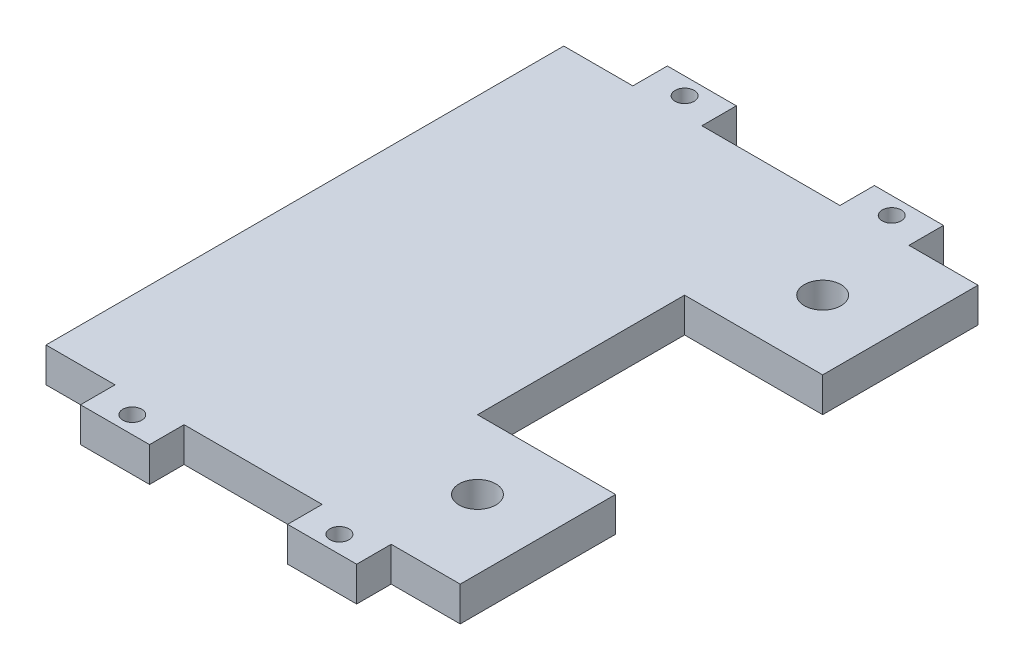
ISO-10303-21;
HEADER;
FILE_DESCRIPTION(('STEP AP214'),'2;1');
FILE_NAME('part.step','',(''),(''),'','','');
FILE_SCHEMA(('AUTOMOTIVE_DESIGN { 1 0 10303 214 1 1 1 1 }'));
ENDSEC;
DATA;
#1=APPLICATION_CONTEXT('core data for automotive mechanical design processes');
#2=APPLICATION_PROTOCOL_DEFINITION('international standard','automotive_design',2000,#1);
#3=PRODUCT_CONTEXT('',#1,'mechanical');
#4=PRODUCT('Part','Part','',(#3));
#5=PRODUCT_RELATED_PRODUCT_CATEGORY('part','',(#4));
#6=PRODUCT_DEFINITION_FORMATION('','',#4);
#7=PRODUCT_DEFINITION_CONTEXT('part definition',#1,'design');
#8=PRODUCT_DEFINITION('design','',#6,#7);
#9=PRODUCT_DEFINITION_SHAPE('','',#8);
#10=(LENGTH_UNIT() NAMED_UNIT(*) SI_UNIT(.MILLI.,.METRE.));
#11=(NAMED_UNIT(*) PLANE_ANGLE_UNIT() SI_UNIT($,.RADIAN.));
#12=(NAMED_UNIT(*) SI_UNIT($,.STERADIAN.) SOLID_ANGLE_UNIT());
#13=UNCERTAINTY_MEASURE_WITH_UNIT(LENGTH_MEASURE(1.E-05),#10,'distance_accuracy_value','');
#14=(GEOMETRIC_REPRESENTATION_CONTEXT(3) GLOBAL_UNCERTAINTY_ASSIGNED_CONTEXT((#13)) GLOBAL_UNIT_ASSIGNED_CONTEXT((#10,
#11,#12)) REPRESENTATION_CONTEXT('',''));
#15=CARTESIAN_POINT('',(0.,0.,0.));
#16=DIRECTION('',(0.,0.,1.));
#17=DIRECTION('',(1.,0.,0.));
#18=AXIS2_PLACEMENT_3D('',#15,#16,#17);
#19=CARTESIAN_POINT('',(38.1,6.35,-53.975));
#20=DIRECTION('',(-1.,0.,0.));
#21=DIRECTION('',(0.,0.,1.));
#22=AXIS2_PLACEMENT_3D('',#19,#20,#21);
#23=PLANE('',#22);
#24=DIRECTION('',(0.,0.,-1.));
#25=VECTOR('',#24,1.);
#26=CARTESIAN_POINT('',(38.1,0.,-53.975));
#27=LINE('',#26,#25);
#28=CARTESIAN_POINT('',(38.1,0.,47.625));
#29=VERTEX_POINT('',#28);
#30=CARTESIAN_POINT('',(38.1,0.,19.05));
#31=VERTEX_POINT('',#30);
#32=EDGE_CURVE('E42',#29,#31,#27,.T.);
#33=ORIENTED_EDGE('',*,*,#32,.T.);
#34=DIRECTION('',(0.,1.,0.));
#35=VECTOR('',#34,1.);
#36=CARTESIAN_POINT('',(38.1,-0.00100000000000013,19.05));
#37=LINE('',#36,#35);
#38=CARTESIAN_POINT('',(38.1,6.35,19.05));
#39=VERTEX_POINT('',#38);
#40=EDGE_CURVE('E249',#31,#39,#37,.T.);
#41=ORIENTED_EDGE('',*,*,#40,.T.);
#42=DIRECTION('',(0.,0.,-1.));
#43=VECTOR('',#42,1.);
#44=CARTESIAN_POINT('',(38.1,6.35,-53.975));
#45=LINE('',#44,#43);
#46=CARTESIAN_POINT('',(38.1,6.35,47.625));
#47=VERTEX_POINT('',#46);
#48=EDGE_CURVE('E11',#47,#39,#45,.T.);
#49=ORIENTED_EDGE('',*,*,#48,.F.);
#50=DIRECTION('',(0.,1.,0.));
#51=VECTOR('',#50,1.);
#52=CARTESIAN_POINT('',(38.1,0.,47.625));
#53=LINE('',#52,#51);
#54=EDGE_CURVE('E275',#29,#47,#53,.T.);
#55=ORIENTED_EDGE('',*,*,#54,.F.);
#56=EDGE_LOOP('',(#33,#41,#49,#55));
#57=FACE_BOUND('',#56,.T.);
#58=ADVANCED_FACE('F38',(#57),#23,.F.);
#59=CARTESIAN_POINT('',(-38.1,6.35,53.975));
#60=DIRECTION('',(0.,0.,-1.));
#61=DIRECTION('',(-1.,0.,0.));
#62=AXIS2_PLACEMENT_3D('',#59,#60,#61);
#63=PLANE('',#62);
#64=DIRECTION('',(1.,0.,0.));
#65=VECTOR('',#64,1.);
#66=CARTESIAN_POINT('',(-38.1,6.35,53.975));
#67=LINE('',#66,#65);
#68=CARTESIAN_POINT('',(-25.4,6.35,53.975));
#69=VERTEX_POINT('',#68);
#70=CARTESIAN_POINT('',(-12.7,6.35,53.975));
#71=VERTEX_POINT('',#70);
#72=EDGE_CURVE('E311',#69,#71,#67,.T.);
#73=ORIENTED_EDGE('',*,*,#72,.F.);
#74=DIRECTION('',(0.,1.,0.));
#75=VECTOR('',#74,1.);
#76=CARTESIAN_POINT('',(-25.4,0.,53.975));
#77=LINE('',#76,#75);
#78=CARTESIAN_POINT('',(-25.4,0.,53.975));
#79=VERTEX_POINT('',#78);
#80=EDGE_CURVE('E498',#79,#69,#77,.T.);
#81=ORIENTED_EDGE('',*,*,#80,.F.);
#82=DIRECTION('',(1.,0.,0.));
#83=VECTOR('',#82,1.);
#84=CARTESIAN_POINT('',(-38.1,0.,53.975));
#85=LINE('',#84,#83);
#86=CARTESIAN_POINT('',(-12.7,0.,53.975));
#87=VERTEX_POINT('',#86);
#88=EDGE_CURVE('E284',#79,#87,#85,.T.);
#89=ORIENTED_EDGE('',*,*,#88,.T.);
#90=DIRECTION('',(0.,1.,0.));
#91=VECTOR('',#90,1.);
#92=CARTESIAN_POINT('',(-12.7,0.,53.975));
#93=LINE('',#92,#91);
#94=EDGE_CURVE('E457',#87,#71,#93,.T.);
#95=ORIENTED_EDGE('',*,*,#94,.T.);
#96=EDGE_LOOP('',(#73,#81,#89,#95));
#97=FACE_BOUND('',#96,.T.);
#98=ADVANCED_FACE('F579',(#97),#63,.F.);
#99=CARTESIAN_POINT('',(-38.1,6.35,-53.975));
#100=DIRECTION('',(0.,0.,1.));
#101=DIRECTION('',(1.,0.,0.));
#102=AXIS2_PLACEMENT_3D('',#99,#100,#101);
#103=PLANE('',#102);
#104=DIRECTION('',(-1.,0.,0.));
#105=VECTOR('',#104,1.);
#106=CARTESIAN_POINT('',(-38.1,6.35,-53.975));
#107=LINE('',#106,#105);
#108=CARTESIAN_POINT('',(-12.7,6.35,-53.975));
#109=VERTEX_POINT('',#108);
#110=CARTESIAN_POINT('',(-25.4,6.35,-53.975));
#111=VERTEX_POINT('',#110);
#112=EDGE_CURVE('E277',#109,#111,#107,.T.);
#113=ORIENTED_EDGE('',*,*,#112,.F.);
#114=DIRECTION('',(0.,1.,0.));
#115=VECTOR('',#114,1.);
#116=CARTESIAN_POINT('',(-12.7,0.,-53.975));
#117=LINE('',#116,#115);
#118=CARTESIAN_POINT('',(-12.7,0.,-53.975));
#119=VERTEX_POINT('',#118);
#120=EDGE_CURVE('E340',#119,#109,#117,.T.);
#121=ORIENTED_EDGE('',*,*,#120,.F.);
#122=DIRECTION('',(-1.,0.,0.));
#123=VECTOR('',#122,1.);
#124=CARTESIAN_POINT('',(-38.1,0.,-53.975));
#125=LINE('',#124,#123);
#126=CARTESIAN_POINT('',(-25.4,0.,-53.975));
#127=VERTEX_POINT('',#126);
#128=EDGE_CURVE('E309',#119,#127,#125,.T.);
#129=ORIENTED_EDGE('',*,*,#128,.T.);
#130=DIRECTION('',(0.,1.,0.));
#131=VECTOR('',#130,1.);
#132=CARTESIAN_POINT('',(-25.4,0.,-53.975));
#133=LINE('',#132,#131);
#134=EDGE_CURVE('E327',#127,#111,#133,.T.);
#135=ORIENTED_EDGE('',*,*,#134,.T.);
#136=EDGE_LOOP('',(#113,#121,#129,#135));
#137=FACE_BOUND('',#136,.T.);
#138=ADVANCED_FACE('F585',(#137),#103,.F.);
#139=CARTESIAN_POINT('',(25.4,6.35,-53.975));
#140=VERTEX_POINT('',#139);
#141=CARTESIAN_POINT('',(12.7,6.35,-53.975));
#142=VERTEX_POINT('',#141);
#143=EDGE_CURVE('E281',#140,#142,#107,.T.);
#144=ORIENTED_EDGE('',*,*,#143,.F.);
#145=DIRECTION('',(0.,1.,0.));
#146=VECTOR('',#145,1.);
#147=CARTESIAN_POINT('',(25.4,0.,-53.975));
#148=LINE('',#147,#146);
#149=CARTESIAN_POINT('',(25.4,0.,-53.975));
#150=VERTEX_POINT('',#149);
#151=EDGE_CURVE('E384',#150,#140,#148,.T.);
#152=ORIENTED_EDGE('',*,*,#151,.F.);
#153=CARTESIAN_POINT('',(12.7,0.,-53.975));
#154=VERTEX_POINT('',#153);
#155=EDGE_CURVE('E307',#150,#154,#125,.T.);
#156=ORIENTED_EDGE('',*,*,#155,.T.);
#157=DIRECTION('',(0.,1.,0.));
#158=VECTOR('',#157,1.);
#159=CARTESIAN_POINT('',(12.7,0.,-53.975));
#160=LINE('',#159,#158);
#161=EDGE_CURVE('E354',#154,#142,#160,.T.);
#162=ORIENTED_EDGE('',*,*,#161,.T.);
#163=EDGE_LOOP('',(#144,#152,#156,#162));
#164=FACE_BOUND('',#163,.T.);
#165=ADVANCED_FACE('F40',(#164),#103,.F.);
#166=CARTESIAN_POINT('',(-38.1,6.35,-53.975));
#167=DIRECTION('',(1.,0.,0.));
#168=DIRECTION('',(0.,0.,-1.));
#169=AXIS2_PLACEMENT_3D('',#166,#167,#168);
#170=PLANE('',#169);
#171=DIRECTION('',(0.,0.,1.));
#172=VECTOR('',#171,1.);
#173=CARTESIAN_POINT('',(-38.1,0.,-53.975));
#174=LINE('',#173,#172);
#175=CARTESIAN_POINT('',(-38.1,0.,-47.625));
#176=VERTEX_POINT('',#175);
#177=CARTESIAN_POINT('',(-38.1,0.,47.625));
#178=VERTEX_POINT('',#177);
#179=EDGE_CURVE('E302',#176,#178,#174,.T.);
#180=ORIENTED_EDGE('',*,*,#179,.T.);
#181=DIRECTION('',(0.,1.,0.));
#182=VECTOR('',#181,1.);
#183=CARTESIAN_POINT('',(-38.1,0.,47.625));
#184=LINE('',#183,#182);
#185=CARTESIAN_POINT('',(-38.1,6.35,47.625));
#186=VERTEX_POINT('',#185);
#187=EDGE_CURVE('E487',#178,#186,#184,.T.);
#188=ORIENTED_EDGE('',*,*,#187,.T.);
#189=DIRECTION('',(0.,0.,1.));
#190=VECTOR('',#189,1.);
#191=CARTESIAN_POINT('',(-38.1,6.35,-53.975));
#192=LINE('',#191,#190);
#193=CARTESIAN_POINT('',(-38.1,6.35,-47.625));
#194=VERTEX_POINT('',#193);
#195=EDGE_CURVE('E315',#194,#186,#192,.T.);
#196=ORIENTED_EDGE('',*,*,#195,.F.);
#197=DIRECTION('',(0.,1.,0.));
#198=VECTOR('',#197,1.);
#199=CARTESIAN_POINT('',(-38.1,0.,-47.625));
#200=LINE('',#199,#198);
#201=EDGE_CURVE('E320',#176,#194,#200,.T.);
#202=ORIENTED_EDGE('',*,*,#201,.F.);
#203=EDGE_LOOP('',(#180,#188,#196,#202));
#204=FACE_BOUND('',#203,.T.);
#205=ADVANCED_FACE('F595',(#204),#170,.F.);
#206=CARTESIAN_POINT('',(12.7,6.35,53.975));
#207=VERTEX_POINT('',#206);
#208=CARTESIAN_POINT('',(25.4,6.35,53.975));
#209=VERTEX_POINT('',#208);
#210=EDGE_CURVE('E314',#207,#209,#67,.T.);
#211=ORIENTED_EDGE('',*,*,#210,.F.);
#212=DIRECTION('',(0.,1.,0.));
#213=VECTOR('',#212,1.);
#214=CARTESIAN_POINT('',(12.7,0.,53.975));
#215=LINE('',#214,#213);
#216=CARTESIAN_POINT('',(12.7,0.,53.975));
#217=VERTEX_POINT('',#216);
#218=EDGE_CURVE('E463',#217,#207,#215,.T.);
#219=ORIENTED_EDGE('',*,*,#218,.F.);
#220=CARTESIAN_POINT('',(25.4,0.,53.975));
#221=VERTEX_POINT('',#220);
#222=EDGE_CURVE('E293',#217,#221,#85,.T.);
#223=ORIENTED_EDGE('',*,*,#222,.T.);
#224=DIRECTION('',(0.,1.,0.));
#225=VECTOR('',#224,1.);
#226=CARTESIAN_POINT('',(25.4,0.,53.975));
#227=LINE('',#226,#225);
#228=EDGE_CURVE('E437',#221,#209,#227,.T.);
#229=ORIENTED_EDGE('',*,*,#228,.T.);
#230=EDGE_LOOP('',(#211,#219,#223,#229));
#231=FACE_BOUND('',#230,.T.);
#232=ADVANCED_FACE('F587',(#231),#63,.F.);
#233=CARTESIAN_POINT('',(38.1,6.35,-19.05));
#234=VERTEX_POINT('',#233);
#235=CARTESIAN_POINT('',(38.1,6.35,-47.625));
#236=VERTEX_POINT('',#235);
#237=EDGE_CURVE('E48',#234,#236,#45,.T.);
#238=ORIENTED_EDGE('',*,*,#237,.F.);
#239=DIRECTION('',(0.,1.,0.));
#240=VECTOR('',#239,1.);
#241=CARTESIAN_POINT('',(38.1,-0.00100000000000013,-19.05));
#242=LINE('',#241,#240);
#243=CARTESIAN_POINT('',(38.1,0.,-19.05));
#244=VERTEX_POINT('',#243);
#245=EDGE_CURVE('E521',#244,#234,#242,.T.);
#246=ORIENTED_EDGE('',*,*,#245,.F.);
#247=CARTESIAN_POINT('',(38.1,0.,-47.625));
#248=VERTEX_POINT('',#247);
#249=EDGE_CURVE('E278',#244,#248,#27,.T.);
#250=ORIENTED_EDGE('',*,*,#249,.T.);
#251=DIRECTION('',(0.,1.,0.));
#252=VECTOR('',#251,1.);
#253=CARTESIAN_POINT('',(38.1,0.,-47.625));
#254=LINE('',#253,#252);
#255=EDGE_CURVE('E373',#248,#236,#254,.T.);
#256=ORIENTED_EDGE('',*,*,#255,.T.);
#257=EDGE_LOOP('',(#238,#246,#250,#256));
#258=FACE_BOUND('',#257,.T.);
#259=ADVANCED_FACE('F581',(#258),#23,.F.);
#260=CARTESIAN_POINT('',(0.,6.35,0.));
#261=DIRECTION('',(0.,-1.,0.));
#262=DIRECTION('',(0.,0.,-1.));
#263=AXIS2_PLACEMENT_3D('',#260,#261,#262);
#264=PLANE('',#263);
#265=CARTESIAN_POINT('',(25.4,6.35,-31.75));
#266=DIRECTION('',(0.,-1.,0.));
#267=DIRECTION('',(0.,0.,-1.));
#268=AXIS2_PLACEMENT_3D('',#265,#266,#267);
#269=CIRCLE('',#268,3.37819999999999);
#270=CARTESIAN_POINT('',(25.4,6.35,-35.1282));
#271=VERTEX_POINT('',#270);
#272=EDGE_CURVE('E546',#271,#271,#269,.T.);
#273=ORIENTED_EDGE('',*,*,#272,.T.);
#274=EDGE_LOOP('',(#273));
#275=FACE_BOUND('',#274,.T.);
#276=CARTESIAN_POINT('',(25.4,6.35,31.75));
#277=DIRECTION('',(0.,-1.,0.));
#278=DIRECTION('',(0.,0.,-1.));
#279=AXIS2_PLACEMENT_3D('',#276,#277,#278);
#280=CIRCLE('',#279,3.37819999999999);
#281=CARTESIAN_POINT('',(25.4,6.35,28.3718));
#282=VERTEX_POINT('',#281);
#283=EDGE_CURVE('E538',#282,#282,#280,.T.);
#284=ORIENTED_EDGE('',*,*,#283,.T.);
#285=EDGE_LOOP('',(#284));
#286=FACE_BOUND('',#285,.T.);
#287=CARTESIAN_POINT('',(-19.05,6.35,50.8));
#288=DIRECTION('',(0.,1.,0.));
#289=DIRECTION('',(0.,0.,-1.));
#290=AXIS2_PLACEMENT_3D('',#287,#288,#289);
#291=CIRCLE('',#290,1.7526);
#292=CARTESIAN_POINT('',(-19.05,6.35,49.0474));
#293=VERTEX_POINT('',#292);
#294=EDGE_CURVE('E433',#293,#293,#291,.T.);
#295=ORIENTED_EDGE('',*,*,#294,.F.);
#296=EDGE_LOOP('',(#295));
#297=FACE_BOUND('',#296,.T.);
#298=CARTESIAN_POINT('',(19.05,6.35,50.8));
#299=DIRECTION('',(0.,1.,0.));
#300=DIRECTION('',(0.,0.,-1.));
#301=AXIS2_PLACEMENT_3D('',#298,#299,#300);
#302=CIRCLE('',#301,1.7526);
#303=CARTESIAN_POINT('',(19.05,6.35,49.0474));
#304=VERTEX_POINT('',#303);
#305=EDGE_CURVE('E425',#304,#304,#302,.T.);
#306=ORIENTED_EDGE('',*,*,#305,.F.);
#307=EDGE_LOOP('',(#306));
#308=FACE_BOUND('',#307,.T.);
#309=CARTESIAN_POINT('',(19.05,6.35,-50.8));
#310=DIRECTION('',(0.,1.,0.));
#311=DIRECTION('',(0.,0.,1.));
#312=AXIS2_PLACEMENT_3D('',#309,#310,#311);
#313=CIRCLE('',#312,1.7526);
#314=CARTESIAN_POINT('',(19.05,6.35,-49.0474));
#315=VERTEX_POINT('',#314);
#316=EDGE_CURVE('E417',#315,#315,#313,.T.);
#317=ORIENTED_EDGE('',*,*,#316,.F.);
#318=EDGE_LOOP('',(#317));
#319=FACE_BOUND('',#318,.T.);
#320=CARTESIAN_POINT('',(-19.05,6.35,-50.8));
#321=DIRECTION('',(0.,1.,0.));
#322=DIRECTION('',(0.,0.,1.));
#323=AXIS2_PLACEMENT_3D('',#320,#321,#322);
#324=CIRCLE('',#323,1.7526);
#325=CARTESIAN_POINT('',(-19.05,6.35,-49.0474));
#326=VERTEX_POINT('',#325);
#327=EDGE_CURVE('E409',#326,#326,#324,.T.);
#328=ORIENTED_EDGE('',*,*,#327,.F.);
#329=EDGE_LOOP('',(#328));
#330=FACE_BOUND('',#329,.T.);
#331=ORIENTED_EDGE('',*,*,#48,.T.);
#332=DIRECTION('',(1.,0.,0.));
#333=VECTOR('',#332,1.);
#334=CARTESIAN_POINT('',(38.1,6.35,19.05));
#335=LINE('',#334,#333);
#336=CARTESIAN_POINT('',(12.7,6.35,19.05));
#337=VERTEX_POINT('',#336);
#338=EDGE_CURVE('E255',#337,#39,#335,.T.);
#339=ORIENTED_EDGE('',*,*,#338,.F.);
#340=DIRECTION('',(0.,0.,1.));
#341=VECTOR('',#340,1.);
#342=CARTESIAN_POINT('',(12.7,6.35,-19.05));
#343=LINE('',#342,#341);
#344=CARTESIAN_POINT('',(12.7,6.35,-19.05));
#345=VERTEX_POINT('',#344);
#346=EDGE_CURVE('E530',#345,#337,#343,.T.);
#347=ORIENTED_EDGE('',*,*,#346,.F.);
#348=DIRECTION('',(-1.,0.,0.));
#349=VECTOR('',#348,1.);
#350=CARTESIAN_POINT('',(38.1,6.35,-19.05));
#351=LINE('',#350,#349);
#352=EDGE_CURVE('E272',#234,#345,#351,.T.);
#353=ORIENTED_EDGE('',*,*,#352,.F.);
#354=ORIENTED_EDGE('',*,*,#237,.T.);
#355=DIRECTION('',(1.,0.,0.));
#356=VECTOR('',#355,1.);
#357=CARTESIAN_POINT('',(38.1,6.35,-47.625));
#358=LINE('',#357,#356);
#359=CARTESIAN_POINT('',(25.4,6.35,-47.625));
#360=VERTEX_POINT('',#359);
#361=EDGE_CURVE('E393',#360,#236,#358,.T.);
#362=ORIENTED_EDGE('',*,*,#361,.F.);
#363=DIRECTION('',(0.,0.,1.));
#364=VECTOR('',#363,1.);
#365=CARTESIAN_POINT('',(25.4,6.35,-53.975));
#366=LINE('',#365,#364);
#367=EDGE_CURVE('E398',#140,#360,#366,.T.);
#368=ORIENTED_EDGE('',*,*,#367,.F.);
#369=ORIENTED_EDGE('',*,*,#143,.T.);
#370=DIRECTION('',(0.,0.,-1.));
#371=VECTOR('',#370,1.);
#372=CARTESIAN_POINT('',(12.7,6.35,-53.975));
#373=LINE('',#372,#371);
#374=CARTESIAN_POINT('',(12.7,6.35,-47.625));
#375=VERTEX_POINT('',#374);
#376=EDGE_CURVE('E360',#375,#142,#373,.T.);
#377=ORIENTED_EDGE('',*,*,#376,.F.);
#378=DIRECTION('',(1.,0.,0.));
#379=VECTOR('',#378,1.);
#380=CARTESIAN_POINT('',(-12.7,6.35,-47.6249999999999));
#381=LINE('',#380,#379);
#382=CARTESIAN_POINT('',(-12.7,6.35,-47.6249999999999));
#383=VERTEX_POINT('',#382);
#384=EDGE_CURVE('E365',#383,#375,#381,.T.);
#385=ORIENTED_EDGE('',*,*,#384,.F.);
#386=DIRECTION('',(0.,0.,1.));
#387=VECTOR('',#386,1.);
#388=CARTESIAN_POINT('',(-12.7,6.35,-53.975));
#389=LINE('',#388,#387);
#390=EDGE_CURVE('E369',#109,#383,#389,.T.);
#391=ORIENTED_EDGE('',*,*,#390,.F.);
#392=ORIENTED_EDGE('',*,*,#112,.T.);
#393=DIRECTION('',(0.,0.,-1.));
#394=VECTOR('',#393,1.);
#395=CARTESIAN_POINT('',(-25.4,6.35,-53.975));
#396=LINE('',#395,#394);
#397=CARTESIAN_POINT('',(-25.4,6.35,-47.6249999999999));
#398=VERTEX_POINT('',#397);
#399=EDGE_CURVE('E331',#398,#111,#396,.T.);
#400=ORIENTED_EDGE('',*,*,#399,.F.);
#401=DIRECTION('',(1.,0.,0.));
#402=VECTOR('',#401,1.);
#403=CARTESIAN_POINT('',(-38.1,6.35,-47.625));
#404=LINE('',#403,#402);
#405=EDGE_CURVE('E336',#194,#398,#404,.T.);
#406=ORIENTED_EDGE('',*,*,#405,.F.);
#407=ORIENTED_EDGE('',*,*,#195,.T.);
#408=DIRECTION('',(-1.,0.,0.));
#409=VECTOR('',#408,1.);
#410=CARTESIAN_POINT('',(-38.1,6.35,47.625));
#411=LINE('',#410,#409);
#412=CARTESIAN_POINT('',(-25.4,6.35,47.6249999999999));
#413=VERTEX_POINT('',#412);
#414=EDGE_CURVE('E507',#413,#186,#411,.T.);
#415=ORIENTED_EDGE('',*,*,#414,.F.);
#416=DIRECTION('',(0.,0.,-1.));
#417=VECTOR('',#416,1.);
#418=CARTESIAN_POINT('',(-25.4,6.35,53.975));
#419=LINE('',#418,#417);
#420=EDGE_CURVE('E511',#69,#413,#419,.T.);
#421=ORIENTED_EDGE('',*,*,#420,.F.);
#422=ORIENTED_EDGE('',*,*,#72,.T.);
#423=DIRECTION('',(0.,0.,1.));
#424=VECTOR('',#423,1.);
#425=CARTESIAN_POINT('',(-12.7,6.35,53.975));
#426=LINE('',#425,#424);
#427=CARTESIAN_POINT('',(-12.7,6.35,47.6249999999999));
#428=VERTEX_POINT('',#427);
#429=EDGE_CURVE('E475',#428,#71,#426,.T.);
#430=ORIENTED_EDGE('',*,*,#429,.F.);
#431=DIRECTION('',(-1.,0.,0.));
#432=VECTOR('',#431,1.);
#433=CARTESIAN_POINT('',(-12.7,6.35,47.6249999999999));
#434=LINE('',#433,#432);
#435=CARTESIAN_POINT('',(12.7,6.35,47.625));
#436=VERTEX_POINT('',#435);
#437=EDGE_CURVE('E480',#436,#428,#434,.T.);
#438=ORIENTED_EDGE('',*,*,#437,.F.);
#439=DIRECTION('',(0.,0.,-1.));
#440=VECTOR('',#439,1.);
#441=CARTESIAN_POINT('',(12.7,6.35,53.975));
#442=LINE('',#441,#440);
#443=EDGE_CURVE('E483',#207,#436,#442,.T.);
#444=ORIENTED_EDGE('',*,*,#443,.F.);
#445=ORIENTED_EDGE('',*,*,#210,.T.);
#446=DIRECTION('',(0.,0.,1.));
#447=VECTOR('',#446,1.);
#448=CARTESIAN_POINT('',(25.4,6.35,53.975));
#449=LINE('',#448,#447);
#450=CARTESIAN_POINT('',(25.4,6.35,47.625));
#451=VERTEX_POINT('',#450);
#452=EDGE_CURVE('E448',#451,#209,#449,.T.);
#453=ORIENTED_EDGE('',*,*,#452,.F.);
#454=DIRECTION('',(-1.,0.,0.));
#455=VECTOR('',#454,1.);
#456=CARTESIAN_POINT('',(38.1,6.35,47.625));
#457=LINE('',#456,#455);
#458=EDGE_CURVE('E453',#47,#451,#457,.T.);
#459=ORIENTED_EDGE('',*,*,#458,.F.);
#460=EDGE_LOOP('',(#331,#339,#347,#353,#354,#362,#368,#369,#377,#385,#391,#392,#400,#406,#407,
#415,#421,#422,#430,#438,#444,#445,#453,#459));
#461=FACE_BOUND('',#460,.T.);
#462=ADVANCED_FACE('F559',(#275,#286,#297,#308,#319,#330,#461),#264,.F.);
#463=CARTESIAN_POINT('',(0.,0.,0.));
#464=DIRECTION('',(0.,-1.,0.));
#465=DIRECTION('',(0.,0.,-1.));
#466=AXIS2_PLACEMENT_3D('',#463,#464,#465);
#467=PLANE('',#466);
#468=CARTESIAN_POINT('',(25.4,0.,-31.75));
#469=DIRECTION('',(0.,-1.,0.));
#470=DIRECTION('',(0.,0.,-1.));
#471=AXIS2_PLACEMENT_3D('',#468,#469,#470);
#472=CIRCLE('',#471,3.37819999999999);
#473=CARTESIAN_POINT('',(25.4,0.,-35.1282));
#474=VERTEX_POINT('',#473);
#475=EDGE_CURVE('E550',#474,#474,#472,.T.);
#476=ORIENTED_EDGE('',*,*,#475,.F.);
#477=EDGE_LOOP('',(#476));
#478=FACE_BOUND('',#477,.T.);
#479=CARTESIAN_POINT('',(25.4,0.,31.75));
#480=DIRECTION('',(0.,-1.,0.));
#481=DIRECTION('',(0.,0.,-1.));
#482=AXIS2_PLACEMENT_3D('',#479,#480,#481);
#483=CIRCLE('',#482,3.37819999999999);
#484=CARTESIAN_POINT('',(25.4,0.,28.3718));
#485=VERTEX_POINT('',#484);
#486=EDGE_CURVE('E542',#485,#485,#483,.T.);
#487=ORIENTED_EDGE('',*,*,#486,.F.);
#488=EDGE_LOOP('',(#487));
#489=FACE_BOUND('',#488,.T.);
#490=DIRECTION('',(1.,0.,0.));
#491=VECTOR('',#490,1.);
#492=CARTESIAN_POINT('',(38.1,0.,19.05));
#493=LINE('',#492,#491);
#494=CARTESIAN_POINT('',(12.7,0.,19.05));
#495=VERTEX_POINT('',#494);
#496=EDGE_CURVE('E252',#495,#31,#493,.T.);
#497=ORIENTED_EDGE('',*,*,#496,.T.);
#498=ORIENTED_EDGE('',*,*,#32,.F.);
#499=DIRECTION('',(-1.,0.,0.));
#500=VECTOR('',#499,1.);
#501=CARTESIAN_POINT('',(38.1,0.,47.625));
#502=LINE('',#501,#500);
#503=CARTESIAN_POINT('',(25.4,0.,47.625));
#504=VERTEX_POINT('',#503);
#505=EDGE_CURVE('E452',#29,#504,#502,.T.);
#506=ORIENTED_EDGE('',*,*,#505,.T.);
#507=DIRECTION('',(0.,0.,1.));
#508=VECTOR('',#507,1.);
#509=CARTESIAN_POINT('',(25.4,0.,53.975));
#510=LINE('',#509,#508);
#511=EDGE_CURVE('E442',#504,#221,#510,.T.);
#512=ORIENTED_EDGE('',*,*,#511,.T.);
#513=ORIENTED_EDGE('',*,*,#222,.F.);
#514=DIRECTION('',(0.,0.,-1.));
#515=VECTOR('',#514,1.);
#516=CARTESIAN_POINT('',(12.7,0.,53.975));
#517=LINE('',#516,#515);
#518=CARTESIAN_POINT('',(12.7,0.,47.625));
#519=VERTEX_POINT('',#518);
#520=EDGE_CURVE('E479',#217,#519,#517,.T.);
#521=ORIENTED_EDGE('',*,*,#520,.T.);
#522=DIRECTION('',(-1.,0.,0.));
#523=VECTOR('',#522,1.);
#524=CARTESIAN_POINT('',(-12.7,0.,47.6249999999999));
#525=LINE('',#524,#523);
#526=CARTESIAN_POINT('',(-12.7,0.,47.6249999999999));
#527=VERTEX_POINT('',#526);
#528=EDGE_CURVE('E491',#519,#527,#525,.T.);
#529=ORIENTED_EDGE('',*,*,#528,.T.);
#530=DIRECTION('',(0.,0.,1.));
#531=VECTOR('',#530,1.);
#532=CARTESIAN_POINT('',(-12.7,0.,53.975));
#533=LINE('',#532,#531);
#534=EDGE_CURVE('E467',#527,#87,#533,.T.);
#535=ORIENTED_EDGE('',*,*,#534,.T.);
#536=ORIENTED_EDGE('',*,*,#88,.F.);
#537=DIRECTION('',(0.,0.,-1.));
#538=VECTOR('',#537,1.);
#539=CARTESIAN_POINT('',(-25.4,0.,53.975));
#540=LINE('',#539,#538);
#541=CARTESIAN_POINT('',(-25.4,0.,47.6249999999999));
#542=VERTEX_POINT('',#541);
#543=EDGE_CURVE('E510',#79,#542,#540,.T.);
#544=ORIENTED_EDGE('',*,*,#543,.T.);
#545=DIRECTION('',(-1.,0.,0.));
#546=VECTOR('',#545,1.);
#547=CARTESIAN_POINT('',(-38.1,0.,47.625));
#548=LINE('',#547,#546);
#549=EDGE_CURVE('E70',#542,#178,#548,.T.);
#550=ORIENTED_EDGE('',*,*,#549,.T.);
#551=ORIENTED_EDGE('',*,*,#179,.F.);
#552=DIRECTION('',(1.,0.,0.));
#553=VECTOR('',#552,1.);
#554=CARTESIAN_POINT('',(-38.1,0.,-47.625));
#555=LINE('',#554,#553);
#556=CARTESIAN_POINT('',(-25.4,0.,-47.6249999999999));
#557=VERTEX_POINT('',#556);
#558=EDGE_CURVE('E335',#176,#557,#555,.T.);
#559=ORIENTED_EDGE('',*,*,#558,.T.);
#560=DIRECTION('',(0.,0.,-1.));
#561=VECTOR('',#560,1.);
#562=CARTESIAN_POINT('',(-25.4,0.,-53.975));
#563=LINE('',#562,#561);
#564=EDGE_CURVE('E324',#557,#127,#563,.T.);
#565=ORIENTED_EDGE('',*,*,#564,.T.);
#566=ORIENTED_EDGE('',*,*,#128,.F.);
#567=DIRECTION('',(0.,0.,1.));
#568=VECTOR('',#567,1.);
#569=CARTESIAN_POINT('',(-12.7,0.,-53.975));
#570=LINE('',#569,#568);
#571=CARTESIAN_POINT('',(-12.7,0.,-47.6249999999999));
#572=VERTEX_POINT('',#571);
#573=EDGE_CURVE('E364',#119,#572,#570,.T.);
#574=ORIENTED_EDGE('',*,*,#573,.T.);
#575=DIRECTION('',(1.,0.,0.));
#576=VECTOR('',#575,1.);
#577=CARTESIAN_POINT('',(-12.7,0.,-47.6249999999999));
#578=LINE('',#577,#576);
#579=CARTESIAN_POINT('',(12.7,0.,-47.625));
#580=VERTEX_POINT('',#579);
#581=EDGE_CURVE('E377',#572,#580,#578,.T.);
#582=ORIENTED_EDGE('',*,*,#581,.T.);
#583=DIRECTION('',(0.,0.,-1.));
#584=VECTOR('',#583,1.);
#585=CARTESIAN_POINT('',(12.7,0.,-53.975));
#586=LINE('',#585,#584);
#587=EDGE_CURVE('E351',#580,#154,#586,.T.);
#588=ORIENTED_EDGE('',*,*,#587,.T.);
#589=ORIENTED_EDGE('',*,*,#155,.F.);
#590=DIRECTION('',(0.,0.,1.));
#591=VECTOR('',#590,1.);
#592=CARTESIAN_POINT('',(25.4,0.,-53.975));
#593=LINE('',#592,#591);
#594=CARTESIAN_POINT('',(25.4,0.,-47.625));
#595=VERTEX_POINT('',#594);
#596=EDGE_CURVE('E397',#150,#595,#593,.T.);
#597=ORIENTED_EDGE('',*,*,#596,.T.);
#598=DIRECTION('',(1.,0.,0.));
#599=VECTOR('',#598,1.);
#600=CARTESIAN_POINT('',(38.1,0.,-47.625));
#601=LINE('',#600,#599);
#602=EDGE_CURVE('E388',#595,#248,#601,.T.);
#603=ORIENTED_EDGE('',*,*,#602,.T.);
#604=ORIENTED_EDGE('',*,*,#249,.F.);
#605=DIRECTION('',(-1.,0.,0.));
#606=VECTOR('',#605,1.);
#607=CARTESIAN_POINT('',(38.1,0.,-19.05));
#608=LINE('',#607,#606);
#609=CARTESIAN_POINT('',(12.7,0.,-19.05));
#610=VERTEX_POINT('',#609);
#611=EDGE_CURVE('E260',#244,#610,#608,.T.);
#612=ORIENTED_EDGE('',*,*,#611,.T.);
#613=DIRECTION('',(0.,0.,1.));
#614=VECTOR('',#613,1.);
#615=CARTESIAN_POINT('',(12.7,0.,-19.05));
#616=LINE('',#615,#614);
#617=EDGE_CURVE('E270',#610,#495,#616,.T.);
#618=ORIENTED_EDGE('',*,*,#617,.T.);
#619=EDGE_LOOP('',(#497,#498,#506,#512,#513,#521,#529,#535,#536,#544,#550,#551,#559,#565,#566,
#574,#582,#588,#589,#597,#603,#604,#612,#618));
#620=FACE_BOUND('',#619,.T.);
#621=CARTESIAN_POINT('',(-19.05,0.,50.8));
#622=DIRECTION('',(0.,1.,0.));
#623=DIRECTION('',(0.,0.,-1.));
#624=AXIS2_PLACEMENT_3D('',#621,#622,#623);
#625=CIRCLE('',#624,1.7526);
#626=CARTESIAN_POINT('',(-19.05,0.,49.0474));
#627=VERTEX_POINT('',#626);
#628=EDGE_CURVE('E429',#627,#627,#625,.T.);
#629=ORIENTED_EDGE('',*,*,#628,.T.);
#630=EDGE_LOOP('',(#629));
#631=FACE_BOUND('',#630,.T.);
#632=CARTESIAN_POINT('',(19.05,0.,50.8));
#633=DIRECTION('',(0.,1.,0.));
#634=DIRECTION('',(0.,0.,-1.));
#635=AXIS2_PLACEMENT_3D('',#632,#633,#634);
#636=CIRCLE('',#635,1.7526);
#637=CARTESIAN_POINT('',(19.05,0.,49.0474));
#638=VERTEX_POINT('',#637);
#639=EDGE_CURVE('E421',#638,#638,#636,.T.);
#640=ORIENTED_EDGE('',*,*,#639,.T.);
#641=EDGE_LOOP('',(#640));
#642=FACE_BOUND('',#641,.T.);
#643=CARTESIAN_POINT('',(19.05,0.,-50.8));
#644=DIRECTION('',(0.,1.,0.));
#645=DIRECTION('',(0.,0.,1.));
#646=AXIS2_PLACEMENT_3D('',#643,#644,#645);
#647=CIRCLE('',#646,1.7526);
#648=CARTESIAN_POINT('',(19.05,0.,-49.0474));
#649=VERTEX_POINT('',#648);
#650=EDGE_CURVE('E413',#649,#649,#647,.T.);
#651=ORIENTED_EDGE('',*,*,#650,.T.);
#652=EDGE_LOOP('',(#651));
#653=FACE_BOUND('',#652,.T.);
#654=CARTESIAN_POINT('',(-19.05,0.,-50.8));
#655=DIRECTION('',(0.,1.,0.));
#656=DIRECTION('',(0.,0.,1.));
#657=AXIS2_PLACEMENT_3D('',#654,#655,#656);
#658=CIRCLE('',#657,1.7526);
#659=CARTESIAN_POINT('',(-19.05,0.,-49.0474));
#660=VERTEX_POINT('',#659);
#661=EDGE_CURVE('E402',#660,#660,#658,.T.);
#662=ORIENTED_EDGE('',*,*,#661,.T.);
#663=EDGE_LOOP('',(#662));
#664=FACE_BOUND('',#663,.T.);
#665=ADVANCED_FACE('F266',(#478,#489,#620,#631,#642,#653,#664),#467,.T.);
#666=CARTESIAN_POINT('',(-25.4,0.,-53.975));
#667=DIRECTION('',(1.,0.,0.));
#668=DIRECTION('',(0.,0.,-1.));
#669=AXIS2_PLACEMENT_3D('',#666,#667,#668);
#670=PLANE('',#669);
#671=ORIENTED_EDGE('',*,*,#399,.T.);
#672=ORIENTED_EDGE('',*,*,#134,.F.);
#673=ORIENTED_EDGE('',*,*,#564,.F.);
#674=DIRECTION('',(0.,1.,0.));
#675=VECTOR('',#674,1.);
#676=CARTESIAN_POINT('',(-25.4,0.,-47.6249999999999));
#677=LINE('',#676,#675);
#678=EDGE_CURVE('E323',#557,#398,#677,.T.);
#679=ORIENTED_EDGE('',*,*,#678,.T.);
#680=EDGE_LOOP('',(#671,#672,#673,#679));
#681=FACE_BOUND('',#680,.T.);
#682=ADVANCED_FACE('F558',(#681),#670,.F.);
#683=CARTESIAN_POINT('',(-38.1,0.,-47.625));
#684=DIRECTION('',(0.,0.,1.));
#685=DIRECTION('',(1.,0.,0.));
#686=AXIS2_PLACEMENT_3D('',#683,#684,#685);
#687=PLANE('',#686);
#688=ORIENTED_EDGE('',*,*,#405,.T.);
#689=ORIENTED_EDGE('',*,*,#678,.F.);
#690=ORIENTED_EDGE('',*,*,#558,.F.);
#691=ORIENTED_EDGE('',*,*,#201,.T.);
#692=EDGE_LOOP('',(#688,#689,#690,#691));
#693=FACE_BOUND('',#692,.T.);
#694=ADVANCED_FACE('F635',(#693),#687,.F.);
#695=CARTESIAN_POINT('',(-12.7,0.,-53.975));
#696=DIRECTION('',(-1.,0.,0.));
#697=DIRECTION('',(0.,0.,1.));
#698=AXIS2_PLACEMENT_3D('',#695,#696,#697);
#699=PLANE('',#698);
#700=ORIENTED_EDGE('',*,*,#390,.T.);
#701=DIRECTION('',(0.,1.,0.));
#702=VECTOR('',#701,1.);
#703=CARTESIAN_POINT('',(-12.7,0.,-47.6249999999999));
#704=LINE('',#703,#702);
#705=EDGE_CURVE('E347',#572,#383,#704,.T.);
#706=ORIENTED_EDGE('',*,*,#705,.F.);
#707=ORIENTED_EDGE('',*,*,#573,.F.);
#708=ORIENTED_EDGE('',*,*,#120,.T.);
#709=EDGE_LOOP('',(#700,#706,#707,#708));
#710=FACE_BOUND('',#709,.T.);
#711=ADVANCED_FACE('F711',(#710),#699,.F.);
#712=CARTESIAN_POINT('',(12.7,0.,-53.975));
#713=DIRECTION('',(1.,0.,0.));
#714=DIRECTION('',(0.,0.,-1.));
#715=AXIS2_PLACEMENT_3D('',#712,#713,#714);
#716=PLANE('',#715);
#717=ORIENTED_EDGE('',*,*,#376,.T.);
#718=ORIENTED_EDGE('',*,*,#161,.F.);
#719=ORIENTED_EDGE('',*,*,#587,.F.);
#720=DIRECTION('',(0.,1.,0.));
#721=VECTOR('',#720,1.);
#722=CARTESIAN_POINT('',(12.7,0.,-47.625));
#723=LINE('',#722,#721);
#724=EDGE_CURVE('E350',#580,#375,#723,.T.);
#725=ORIENTED_EDGE('',*,*,#724,.T.);
#726=EDGE_LOOP('',(#717,#718,#719,#725));
#727=FACE_BOUND('',#726,.T.);
#728=ADVANCED_FACE('F616',(#727),#716,.F.);
#729=CARTESIAN_POINT('',(-12.7,0.,-47.6249999999999));
#730=DIRECTION('',(0.,0.,1.));
#731=DIRECTION('',(1.,0.,0.));
#732=AXIS2_PLACEMENT_3D('',#729,#730,#731);
#733=PLANE('',#732);
#734=ORIENTED_EDGE('',*,*,#384,.T.);
#735=ORIENTED_EDGE('',*,*,#724,.F.);
#736=ORIENTED_EDGE('',*,*,#581,.F.);
#737=ORIENTED_EDGE('',*,*,#705,.T.);
#738=EDGE_LOOP('',(#734,#735,#736,#737));
#739=FACE_BOUND('',#738,.T.);
#740=ADVANCED_FACE('F621',(#739),#733,.F.);
#741=CARTESIAN_POINT('',(38.1,0.,-47.625));
#742=DIRECTION('',(0.,0.,1.));
#743=DIRECTION('',(1.,0.,0.));
#744=AXIS2_PLACEMENT_3D('',#741,#742,#743);
#745=PLANE('',#744);
#746=ORIENTED_EDGE('',*,*,#361,.T.);
#747=ORIENTED_EDGE('',*,*,#255,.F.);
#748=ORIENTED_EDGE('',*,*,#602,.F.);
#749=DIRECTION('',(0.,1.,0.));
#750=VECTOR('',#749,1.);
#751=CARTESIAN_POINT('',(25.4,0.,-47.625));
#752=LINE('',#751,#750);
#753=EDGE_CURVE('E387',#595,#360,#752,.T.);
#754=ORIENTED_EDGE('',*,*,#753,.T.);
#755=EDGE_LOOP('',(#746,#747,#748,#754));
#756=FACE_BOUND('',#755,.T.);
#757=ADVANCED_FACE('F605',(#756),#745,.F.);
#758=CARTESIAN_POINT('',(25.4,0.,-53.975));
#759=DIRECTION('',(-1.,0.,0.));
#760=DIRECTION('',(0.,0.,1.));
#761=AXIS2_PLACEMENT_3D('',#758,#759,#760);
#762=PLANE('',#761);
#763=ORIENTED_EDGE('',*,*,#367,.T.);
#764=ORIENTED_EDGE('',*,*,#753,.F.);
#765=ORIENTED_EDGE('',*,*,#596,.F.);
#766=ORIENTED_EDGE('',*,*,#151,.T.);
#767=EDGE_LOOP('',(#763,#764,#765,#766));
#768=FACE_BOUND('',#767,.T.);
#769=ADVANCED_FACE('F608',(#768),#762,.F.);
#770=CARTESIAN_POINT('',(-19.05,0.,-50.8));
#771=DIRECTION('',(0.,1.,0.));
#772=DIRECTION('',(0.,0.,1.));
#773=AXIS2_PLACEMENT_3D('',#770,#771,#772);
#774=CYLINDRICAL_SURFACE('',#773,1.7526);
#775=ORIENTED_EDGE('',*,*,#661,.F.);
#776=EDGE_LOOP('',(#775));
#777=FACE_BOUND('',#776,.T.);
#778=ORIENTED_EDGE('',*,*,#327,.T.);
#779=EDGE_LOOP('',(#778));
#780=FACE_BOUND('',#779,.T.);
#781=ADVANCED_FACE('F700',(#777,#780),#774,.F.);
#782=CARTESIAN_POINT('',(19.05,0.,-50.8));
#783=DIRECTION('',(0.,1.,0.));
#784=DIRECTION('',(0.,0.,1.));
#785=AXIS2_PLACEMENT_3D('',#782,#783,#784);
#786=CYLINDRICAL_SURFACE('',#785,1.7526);
#787=ORIENTED_EDGE('',*,*,#650,.F.);
#788=EDGE_LOOP('',(#787));
#789=FACE_BOUND('',#788,.T.);
#790=ORIENTED_EDGE('',*,*,#316,.T.);
#791=EDGE_LOOP('',(#790));
#792=FACE_BOUND('',#791,.T.);
#793=ADVANCED_FACE('F696',(#789,#792),#786,.F.);
#794=CARTESIAN_POINT('',(19.05,0.,50.8));
#795=DIRECTION('',(0.,1.,0.));
#796=DIRECTION('',(0.,0.,1.));
#797=AXIS2_PLACEMENT_3D('',#794,#795,#796);
#798=CYLINDRICAL_SURFACE('',#797,1.7526);
#799=ORIENTED_EDGE('',*,*,#639,.F.);
#800=EDGE_LOOP('',(#799));
#801=FACE_BOUND('',#800,.T.);
#802=ORIENTED_EDGE('',*,*,#305,.T.);
#803=EDGE_LOOP('',(#802));
#804=FACE_BOUND('',#803,.T.);
#805=ADVANCED_FACE('F692',(#801,#804),#798,.F.);
#806=CARTESIAN_POINT('',(-19.05,0.,50.8));
#807=DIRECTION('',(0.,1.,0.));
#808=DIRECTION('',(0.,0.,1.));
#809=AXIS2_PLACEMENT_3D('',#806,#807,#808);
#810=CYLINDRICAL_SURFACE('',#809,1.7526);
#811=ORIENTED_EDGE('',*,*,#628,.F.);
#812=EDGE_LOOP('',(#811));
#813=FACE_BOUND('',#812,.T.);
#814=ORIENTED_EDGE('',*,*,#294,.T.);
#815=EDGE_LOOP('',(#814));
#816=FACE_BOUND('',#815,.T.);
#817=ADVANCED_FACE('F687',(#813,#816),#810,.F.);
#818=CARTESIAN_POINT('',(25.4,0.,53.975));
#819=DIRECTION('',(-1.,0.,0.));
#820=DIRECTION('',(0.,0.,1.));
#821=AXIS2_PLACEMENT_3D('',#818,#819,#820);
#822=PLANE('',#821);
#823=ORIENTED_EDGE('',*,*,#452,.T.);
#824=ORIENTED_EDGE('',*,*,#228,.F.);
#825=ORIENTED_EDGE('',*,*,#511,.F.);
#826=DIRECTION('',(0.,1.,0.));
#827=VECTOR('',#826,1.);
#828=CARTESIAN_POINT('',(25.4,0.,47.625));
#829=LINE('',#828,#827);
#830=EDGE_CURVE('E441',#504,#451,#829,.T.);
#831=ORIENTED_EDGE('',*,*,#830,.T.);
#832=EDGE_LOOP('',(#823,#824,#825,#831));
#833=FACE_BOUND('',#832,.T.);
#834=ADVANCED_FACE('F662',(#833),#822,.F.);
#835=CARTESIAN_POINT('',(38.1,0.,47.625));
#836=DIRECTION('',(0.,0.,-1.));
#837=DIRECTION('',(-1.,0.,0.));
#838=AXIS2_PLACEMENT_3D('',#835,#836,#837);
#839=PLANE('',#838);
#840=ORIENTED_EDGE('',*,*,#458,.T.);
#841=ORIENTED_EDGE('',*,*,#830,.F.);
#842=ORIENTED_EDGE('',*,*,#505,.F.);
#843=ORIENTED_EDGE('',*,*,#54,.T.);
#844=EDGE_LOOP('',(#840,#841,#842,#843));
#845=FACE_BOUND('',#844,.T.);
#846=ADVANCED_FACE('F664',(#845),#839,.F.);
#847=CARTESIAN_POINT('',(-12.7,0.,53.975));
#848=DIRECTION('',(-1.,0.,0.));
#849=DIRECTION('',(0.,0.,1.));
#850=AXIS2_PLACEMENT_3D('',#847,#848,#849);
#851=PLANE('',#850);
#852=ORIENTED_EDGE('',*,*,#429,.T.);
#853=ORIENTED_EDGE('',*,*,#94,.F.);
#854=ORIENTED_EDGE('',*,*,#534,.F.);
#855=DIRECTION('',(0.,1.,0.));
#856=VECTOR('',#855,1.);
#857=CARTESIAN_POINT('',(-12.7,0.,47.6249999999999));
#858=LINE('',#857,#856);
#859=EDGE_CURVE('E470',#527,#428,#858,.T.);
#860=ORIENTED_EDGE('',*,*,#859,.T.);
#861=EDGE_LOOP('',(#852,#853,#854,#860));
#862=FACE_BOUND('',#861,.T.);
#863=ADVANCED_FACE('F647',(#862),#851,.F.);
#864=CARTESIAN_POINT('',(-12.7,0.,47.6249999999999));
#865=DIRECTION('',(0.,0.,-1.));
#866=DIRECTION('',(-1.,0.,0.));
#867=AXIS2_PLACEMENT_3D('',#864,#865,#866);
#868=PLANE('',#867);
#869=ORIENTED_EDGE('',*,*,#437,.T.);
#870=ORIENTED_EDGE('',*,*,#859,.F.);
#871=ORIENTED_EDGE('',*,*,#528,.F.);
#872=DIRECTION('',(0.,1.,0.));
#873=VECTOR('',#872,1.);
#874=CARTESIAN_POINT('',(12.7,0.,47.625));
#875=LINE('',#874,#873);
#876=EDGE_CURVE('E466',#519,#436,#875,.T.);
#877=ORIENTED_EDGE('',*,*,#876,.T.);
#878=EDGE_LOOP('',(#869,#870,#871,#877));
#879=FACE_BOUND('',#878,.T.);
#880=ADVANCED_FACE('F653',(#879),#868,.F.);
#881=CARTESIAN_POINT('',(12.7,0.,53.975));
#882=DIRECTION('',(1.,0.,0.));
#883=DIRECTION('',(0.,0.,-1.));
#884=AXIS2_PLACEMENT_3D('',#881,#882,#883);
#885=PLANE('',#884);
#886=ORIENTED_EDGE('',*,*,#443,.T.);
#887=ORIENTED_EDGE('',*,*,#876,.F.);
#888=ORIENTED_EDGE('',*,*,#520,.F.);
#889=ORIENTED_EDGE('',*,*,#218,.T.);
#890=EDGE_LOOP('',(#886,#887,#888,#889));
#891=FACE_BOUND('',#890,.T.);
#892=ADVANCED_FACE('F656',(#891),#885,.F.);
#893=CARTESIAN_POINT('',(-38.1,0.,47.625));
#894=DIRECTION('',(0.,0.,-1.));
#895=DIRECTION('',(-1.,0.,0.));
#896=AXIS2_PLACEMENT_3D('',#893,#894,#895);
#897=PLANE('',#896);
#898=ORIENTED_EDGE('',*,*,#414,.T.);
#899=ORIENTED_EDGE('',*,*,#187,.F.);
#900=ORIENTED_EDGE('',*,*,#549,.F.);
#901=DIRECTION('',(0.,1.,0.));
#902=VECTOR('',#901,1.);
#903=CARTESIAN_POINT('',(-25.4,0.,47.6249999999999));
#904=LINE('',#903,#902);
#905=EDGE_CURVE('E501',#542,#413,#904,.T.);
#906=ORIENTED_EDGE('',*,*,#905,.T.);
#907=EDGE_LOOP('',(#898,#899,#900,#906));
#908=FACE_BOUND('',#907,.T.);
#909=ADVANCED_FACE('F642',(#908),#897,.F.);
#910=CARTESIAN_POINT('',(-25.4,0.,53.975));
#911=DIRECTION('',(1.,0.,0.));
#912=DIRECTION('',(0.,0.,-1.));
#913=AXIS2_PLACEMENT_3D('',#910,#911,#912);
#914=PLANE('',#913);
#915=ORIENTED_EDGE('',*,*,#420,.T.);
#916=ORIENTED_EDGE('',*,*,#905,.F.);
#917=ORIENTED_EDGE('',*,*,#543,.F.);
#918=ORIENTED_EDGE('',*,*,#80,.T.);
#919=EDGE_LOOP('',(#915,#916,#917,#918));
#920=FACE_BOUND('',#919,.T.);
#921=ADVANCED_FACE('F644',(#920),#914,.F.);
#922=CARTESIAN_POINT('',(38.1,-0.00100000000000013,19.05));
#923=DIRECTION('',(0.,0.,1.));
#924=DIRECTION('',(1.,0.,0.));
#925=AXIS2_PLACEMENT_3D('',#922,#923,#924);
#926=PLANE('',#925);
#927=DIRECTION('',(0.,1.,0.));
#928=VECTOR('',#927,1.);
#929=CARTESIAN_POINT('',(12.7,-0.00100000000000013,19.05));
#930=LINE('',#929,#928);
#931=EDGE_CURVE('E261',#495,#337,#930,.T.);
#932=ORIENTED_EDGE('',*,*,#931,.T.);
#933=ORIENTED_EDGE('',*,*,#338,.T.);
#934=ORIENTED_EDGE('',*,*,#40,.F.);
#935=ORIENTED_EDGE('',*,*,#496,.F.);
#936=EDGE_LOOP('',(#932,#933,#934,#935));
#937=FACE_BOUND('',#936,.T.);
#938=ADVANCED_FACE('F251',(#937),#926,.F.);
#939=CARTESIAN_POINT('',(12.7,-0.00100000000000013,-19.05));
#940=DIRECTION('',(-1.,0.,0.));
#941=DIRECTION('',(0.,0.,1.));
#942=AXIS2_PLACEMENT_3D('',#939,#940,#941);
#943=PLANE('',#942);
#944=DIRECTION('',(0.,1.,0.));
#945=VECTOR('',#944,1.);
#946=CARTESIAN_POINT('',(12.7,-0.00100000000000013,-19.05));
#947=LINE('',#946,#945);
#948=EDGE_CURVE('E59',#610,#345,#947,.T.);
#949=ORIENTED_EDGE('',*,*,#948,.T.);
#950=ORIENTED_EDGE('',*,*,#346,.T.);
#951=ORIENTED_EDGE('',*,*,#931,.F.);
#952=ORIENTED_EDGE('',*,*,#617,.F.);
#953=EDGE_LOOP('',(#949,#950,#951,#952));
#954=FACE_BOUND('',#953,.T.);
#955=ADVANCED_FACE('F574',(#954),#943,.F.);
#956=CARTESIAN_POINT('',(38.1,-0.00100000000000013,-19.05));
#957=DIRECTION('',(0.,0.,-1.));
#958=DIRECTION('',(-1.,0.,0.));
#959=AXIS2_PLACEMENT_3D('',#956,#957,#958);
#960=PLANE('',#959);
#961=ORIENTED_EDGE('',*,*,#245,.T.);
#962=ORIENTED_EDGE('',*,*,#352,.T.);
#963=ORIENTED_EDGE('',*,*,#948,.F.);
#964=ORIENTED_EDGE('',*,*,#611,.F.);
#965=EDGE_LOOP('',(#961,#962,#963,#964));
#966=FACE_BOUND('',#965,.T.);
#967=ADVANCED_FACE('F565',(#966),#960,.F.);
#968=CARTESIAN_POINT('',(25.4,0.,31.75));
#969=DIRECTION('',(0.,-1.,0.));
#970=DIRECTION('',(0.,0.,-1.));
#971=AXIS2_PLACEMENT_3D('',#968,#969,#970);
#972=CYLINDRICAL_SURFACE('',#971,3.37819999999999);
#973=ORIENTED_EDGE('',*,*,#283,.F.);
#974=EDGE_LOOP('',(#973));
#975=FACE_BOUND('',#974,.T.);
#976=ORIENTED_EDGE('',*,*,#486,.T.);
#977=EDGE_LOOP('',(#976));
#978=FACE_BOUND('',#977,.T.);
#979=ADVANCED_FACE('F563',(#975,#978),#972,.F.);
#980=CARTESIAN_POINT('',(25.4,0.,-31.75));
#981=DIRECTION('',(0.,-1.,0.));
#982=DIRECTION('',(0.,0.,-1.));
#983=AXIS2_PLACEMENT_3D('',#980,#981,#982);
#984=CYLINDRICAL_SURFACE('',#983,3.37819999999999);
#985=ORIENTED_EDGE('',*,*,#272,.F.);
#986=EDGE_LOOP('',(#985));
#987=FACE_BOUND('',#986,.T.);
#988=ORIENTED_EDGE('',*,*,#475,.T.);
#989=EDGE_LOOP('',(#988));
#990=FACE_BOUND('',#989,.T.);
#991=ADVANCED_FACE('F554',(#987,#990),#984,.F.);
#992=CLOSED_SHELL('',(#58,#98,#138,#165,#205,#232,#259,#462,#665,#682,#694,#711,#728,#740,#757,
#769,#781,#793,#805,#817,#834,#846,#863,#880,#892,#909,#921,#938,#955,#967,#979,#991));
#993=MANIFOLD_SOLID_BREP('B2',#992);
#994=ADVANCED_BREP_SHAPE_REPRESENTATION('',(#18,#993),#14);
#995=SHAPE_DEFINITION_REPRESENTATION(#9,#994);
ENDSEC;
END-ISO-10303-21;
